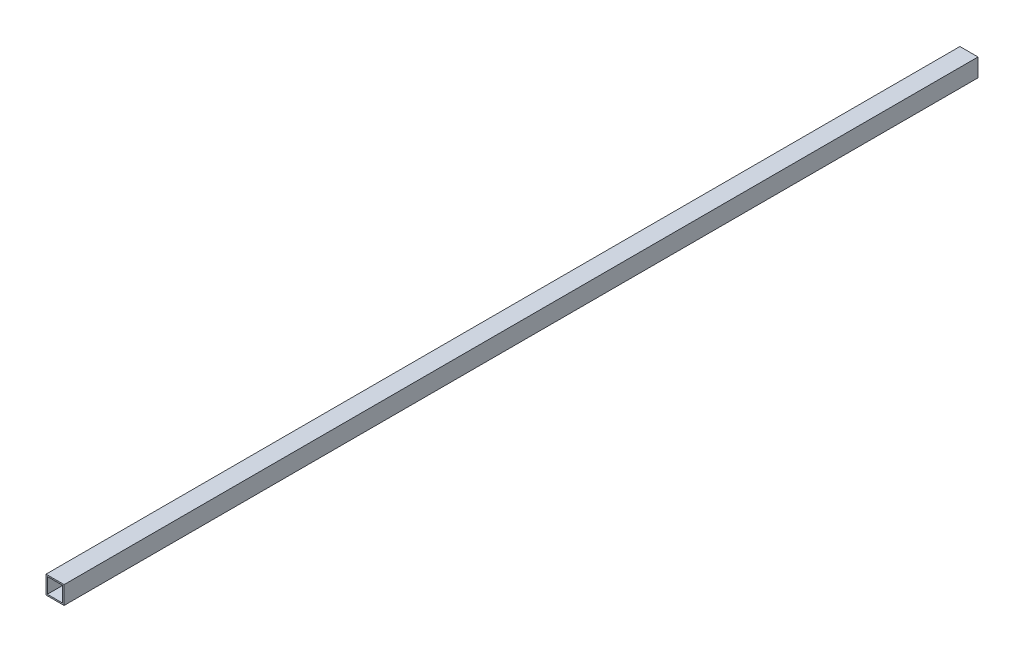
ISO-10303-21;
HEADER;
FILE_DESCRIPTION(('STEP AP214'),'2;1');
FILE_NAME('part.step','',(''),(''),'','','');
FILE_SCHEMA(('AUTOMOTIVE_DESIGN { 1 0 10303 214 1 1 1 1 }'));
ENDSEC;
DATA;
#1=APPLICATION_CONTEXT('core data for automotive mechanical design processes');
#2=APPLICATION_PROTOCOL_DEFINITION('international standard','automotive_design',2000,#1);
#3=PRODUCT_CONTEXT('',#1,'mechanical');
#4=PRODUCT('Part','Part','',(#3));
#5=PRODUCT_RELATED_PRODUCT_CATEGORY('part','',(#4));
#6=PRODUCT_DEFINITION_FORMATION('','',#4);
#7=PRODUCT_DEFINITION_CONTEXT('part definition',#1,'design');
#8=PRODUCT_DEFINITION('design','',#6,#7);
#9=PRODUCT_DEFINITION_SHAPE('','',#8);
#10=(LENGTH_UNIT() NAMED_UNIT(*) SI_UNIT(.MILLI.,.METRE.));
#11=(NAMED_UNIT(*) PLANE_ANGLE_UNIT() SI_UNIT($,.RADIAN.));
#12=(NAMED_UNIT(*) SI_UNIT($,.STERADIAN.) SOLID_ANGLE_UNIT());
#13=UNCERTAINTY_MEASURE_WITH_UNIT(LENGTH_MEASURE(1.E-05),#10,'distance_accuracy_value','');
#14=(GEOMETRIC_REPRESENTATION_CONTEXT(3) GLOBAL_UNCERTAINTY_ASSIGNED_CONTEXT((#13)) GLOBAL_UNIT_ASSIGNED_CONTEXT((#10,
#11,#12)) REPRESENTATION_CONTEXT('',''));
#15=CARTESIAN_POINT('',(0.,0.,0.));
#16=DIRECTION('',(0.,0.,1.));
#17=DIRECTION('',(1.,0.,0.));
#18=AXIS2_PLACEMENT_3D('',#15,#16,#17);
#19=CARTESIAN_POINT('',(0.,0.,2020.));
#20=DIRECTION('',(0.,0.,1.));
#21=DIRECTION('',(1.,0.,0.));
#22=AXIS2_PLACEMENT_3D('',#19,#20,#21);
#23=PLANE('',#22);
#24=DIRECTION('',(0.,1.,0.));
#25=VECTOR('',#24,1.);
#26=CARTESIAN_POINT('',(20.,20.,2020.));
#27=LINE('',#26,#25);
#28=CARTESIAN_POINT('',(20.,-20.,2020.));
#29=VERTEX_POINT('',#28);
#30=CARTESIAN_POINT('',(20.,20.,2020.));
#31=VERTEX_POINT('',#30);
#32=EDGE_CURVE('E137',#29,#31,#27,.T.);
#33=ORIENTED_EDGE('',*,*,#32,.T.);
#34=DIRECTION('',(-1.,0.,0.));
#35=VECTOR('',#34,1.);
#36=CARTESIAN_POINT('',(-20.,20.,2020.));
#37=LINE('',#36,#35);
#38=CARTESIAN_POINT('',(-20.,20.,2020.));
#39=VERTEX_POINT('',#38);
#40=EDGE_CURVE('E140',#31,#39,#37,.T.);
#41=ORIENTED_EDGE('',*,*,#40,.T.);
#42=DIRECTION('',(0.,-1.,0.));
#43=VECTOR('',#42,1.);
#44=CARTESIAN_POINT('',(-20.,20.,2020.));
#45=LINE('',#44,#43);
#46=CARTESIAN_POINT('',(-20.,-20.,2020.));
#47=VERTEX_POINT('',#46);
#48=EDGE_CURVE('E143',#39,#47,#45,.T.);
#49=ORIENTED_EDGE('',*,*,#48,.T.);
#50=DIRECTION('',(1.,0.,0.));
#51=VECTOR('',#50,1.);
#52=CARTESIAN_POINT('',(-20.,-20.,2020.));
#53=LINE('',#52,#51);
#54=EDGE_CURVE('E145',#47,#29,#53,.T.);
#55=ORIENTED_EDGE('',*,*,#54,.T.);
#56=EDGE_LOOP('',(#33,#41,#49,#55));
#57=FACE_BOUND('',#56,.T.);
#58=DIRECTION('',(1.,0.,0.));
#59=VECTOR('',#58,1.);
#60=CARTESIAN_POINT('',(-17.,-17.,2020.));
#61=LINE('',#60,#59);
#62=CARTESIAN_POINT('',(-17.,-17.,2020.));
#63=VERTEX_POINT('',#62);
#64=CARTESIAN_POINT('',(17.,-17.,2020.));
#65=VERTEX_POINT('',#64);
#66=EDGE_CURVE('E109',#63,#65,#61,.T.);
#67=ORIENTED_EDGE('',*,*,#66,.F.);
#68=DIRECTION('',(0.,-1.,0.));
#69=VECTOR('',#68,1.);
#70=CARTESIAN_POINT('',(-17.,17.,2020.));
#71=LINE('',#70,#69);
#72=CARTESIAN_POINT('',(-17.,17.,2020.));
#73=VERTEX_POINT('',#72);
#74=EDGE_CURVE('E101',#73,#63,#71,.T.);
#75=ORIENTED_EDGE('',*,*,#74,.F.);
#76=DIRECTION('',(-1.,0.,0.));
#77=VECTOR('',#76,1.);
#78=CARTESIAN_POINT('',(-17.,17.,2020.));
#79=LINE('',#78,#77);
#80=CARTESIAN_POINT('',(17.,17.,2020.));
#81=VERTEX_POINT('',#80);
#82=EDGE_CURVE('E123',#81,#73,#79,.T.);
#83=ORIENTED_EDGE('',*,*,#82,.F.);
#84=DIRECTION('',(0.,1.,0.));
#85=VECTOR('',#84,1.);
#86=CARTESIAN_POINT('',(17.,17.,2020.));
#87=LINE('',#86,#85);
#88=EDGE_CURVE('E121',#65,#81,#87,.T.);
#89=ORIENTED_EDGE('',*,*,#88,.F.);
#90=EDGE_LOOP('',(#67,#75,#83,#89));
#91=FACE_BOUND('',#90,.T.);
#92=ADVANCED_FACE('F36',(#57,#91),#23,.T.);
#93=CARTESIAN_POINT('',(0.,0.,0.));
#94=DIRECTION('',(0.,0.,1.));
#95=DIRECTION('',(1.,0.,0.));
#96=AXIS2_PLACEMENT_3D('',#93,#94,#95);
#97=PLANE('',#96);
#98=DIRECTION('',(0.,1.,0.));
#99=VECTOR('',#98,1.);
#100=CARTESIAN_POINT('',(20.,20.,0.));
#101=LINE('',#100,#99);
#102=CARTESIAN_POINT('',(20.,-20.,0.));
#103=VERTEX_POINT('',#102);
#104=CARTESIAN_POINT('',(20.,20.,0.));
#105=VERTEX_POINT('',#104);
#106=EDGE_CURVE('E117',#103,#105,#101,.T.);
#107=ORIENTED_EDGE('',*,*,#106,.F.);
#108=DIRECTION('',(1.,0.,0.));
#109=VECTOR('',#108,1.);
#110=CARTESIAN_POINT('',(-20.,-20.,0.));
#111=LINE('',#110,#109);
#112=CARTESIAN_POINT('',(-20.,-20.,0.));
#113=VERTEX_POINT('',#112);
#114=EDGE_CURVE('E141',#113,#103,#111,.T.);
#115=ORIENTED_EDGE('',*,*,#114,.F.);
#116=DIRECTION('',(0.,-1.,0.));
#117=VECTOR('',#116,1.);
#118=CARTESIAN_POINT('',(-20.,20.,0.));
#119=LINE('',#118,#117);
#120=CARTESIAN_POINT('',(-20.,20.,0.));
#121=VERTEX_POINT('',#120);
#122=EDGE_CURVE('E152',#121,#113,#119,.T.);
#123=ORIENTED_EDGE('',*,*,#122,.F.);
#124=DIRECTION('',(-1.,0.,0.));
#125=VECTOR('',#124,1.);
#126=CARTESIAN_POINT('',(-20.,20.,0.));
#127=LINE('',#126,#125);
#128=EDGE_CURVE('E150',#105,#121,#127,.T.);
#129=ORIENTED_EDGE('',*,*,#128,.F.);
#130=EDGE_LOOP('',(#107,#115,#123,#129));
#131=FACE_BOUND('',#130,.T.);
#132=DIRECTION('',(0.,-1.,0.));
#133=VECTOR('',#132,1.);
#134=CARTESIAN_POINT('',(-17.,17.,0.));
#135=LINE('',#134,#133);
#136=CARTESIAN_POINT('',(-17.,17.,0.));
#137=VERTEX_POINT('',#136);
#138=CARTESIAN_POINT('',(-17.,-17.,0.));
#139=VERTEX_POINT('',#138);
#140=EDGE_CURVE('E59',#137,#139,#135,.T.);
#141=ORIENTED_EDGE('',*,*,#140,.T.);
#142=DIRECTION('',(1.,0.,0.));
#143=VECTOR('',#142,1.);
#144=CARTESIAN_POINT('',(-17.,-17.,0.));
#145=LINE('',#144,#143);
#146=CARTESIAN_POINT('',(17.,-17.,0.));
#147=VERTEX_POINT('',#146);
#148=EDGE_CURVE('E116',#139,#147,#145,.T.);
#149=ORIENTED_EDGE('',*,*,#148,.T.);
#150=DIRECTION('',(0.,1.,0.));
#151=VECTOR('',#150,1.);
#152=CARTESIAN_POINT('',(17.,17.,0.));
#153=LINE('',#152,#151);
#154=CARTESIAN_POINT('',(17.,17.,0.));
#155=VERTEX_POINT('',#154);
#156=EDGE_CURVE('E129',#147,#155,#153,.T.);
#157=ORIENTED_EDGE('',*,*,#156,.T.);
#158=DIRECTION('',(-1.,0.,0.));
#159=VECTOR('',#158,1.);
#160=CARTESIAN_POINT('',(-17.,17.,0.));
#161=LINE('',#160,#159);
#162=EDGE_CURVE('E110',#155,#137,#161,.T.);
#163=ORIENTED_EDGE('',*,*,#162,.T.);
#164=EDGE_LOOP('',(#141,#149,#157,#163));
#165=FACE_BOUND('',#164,.T.);
#166=ADVANCED_FACE('F170',(#131,#165),#97,.F.);
#167=CARTESIAN_POINT('',(20.,20.,2020.));
#168=DIRECTION('',(-1.,0.,0.));
#169=DIRECTION('',(0.,-1.,0.));
#170=AXIS2_PLACEMENT_3D('',#167,#168,#169);
#171=PLANE('',#170);
#172=ORIENTED_EDGE('',*,*,#106,.T.);
#173=DIRECTION('',(0.,0.,-1.));
#174=VECTOR('',#173,1.);
#175=CARTESIAN_POINT('',(20.,20.,2020.));
#176=LINE('',#175,#174);
#177=EDGE_CURVE('E11',#31,#105,#176,.T.);
#178=ORIENTED_EDGE('',*,*,#177,.F.);
#179=ORIENTED_EDGE('',*,*,#32,.F.);
#180=DIRECTION('',(0.,0.,-1.));
#181=VECTOR('',#180,1.);
#182=CARTESIAN_POINT('',(20.,-20.,2020.));
#183=LINE('',#182,#181);
#184=EDGE_CURVE('E147',#29,#103,#183,.T.);
#185=ORIENTED_EDGE('',*,*,#184,.T.);
#186=EDGE_LOOP('',(#172,#178,#179,#185));
#187=FACE_BOUND('',#186,.T.);
#188=ADVANCED_FACE('F38',(#187),#171,.F.);
#189=CARTESIAN_POINT('',(-20.,20.,2020.));
#190=DIRECTION('',(0.,-1.,0.));
#191=DIRECTION('',(0.,0.,-1.));
#192=AXIS2_PLACEMENT_3D('',#189,#190,#191);
#193=PLANE('',#192);
#194=ORIENTED_EDGE('',*,*,#128,.T.);
#195=DIRECTION('',(0.,0.,-1.));
#196=VECTOR('',#195,1.);
#197=CARTESIAN_POINT('',(-20.,20.,2020.));
#198=LINE('',#197,#196);
#199=EDGE_CURVE('E44',#39,#121,#198,.T.);
#200=ORIENTED_EDGE('',*,*,#199,.F.);
#201=ORIENTED_EDGE('',*,*,#40,.F.);
#202=ORIENTED_EDGE('',*,*,#177,.T.);
#203=EDGE_LOOP('',(#194,#200,#201,#202));
#204=FACE_BOUND('',#203,.T.);
#205=ADVANCED_FACE('F180',(#204),#193,.F.);
#206=CARTESIAN_POINT('',(-20.,20.,2020.));
#207=DIRECTION('',(1.,0.,0.));
#208=DIRECTION('',(0.,1.,0.));
#209=AXIS2_PLACEMENT_3D('',#206,#207,#208);
#210=PLANE('',#209);
#211=ORIENTED_EDGE('',*,*,#122,.T.);
#212=DIRECTION('',(0.,0.,-1.));
#213=VECTOR('',#212,1.);
#214=CARTESIAN_POINT('',(-20.,-20.,2020.));
#215=LINE('',#214,#213);
#216=EDGE_CURVE('E157',#47,#113,#215,.T.);
#217=ORIENTED_EDGE('',*,*,#216,.F.);
#218=ORIENTED_EDGE('',*,*,#48,.F.);
#219=ORIENTED_EDGE('',*,*,#199,.T.);
#220=EDGE_LOOP('',(#211,#217,#218,#219));
#221=FACE_BOUND('',#220,.T.);
#222=ADVANCED_FACE('F164',(#221),#210,.F.);
#223=CARTESIAN_POINT('',(-20.,-20.,2020.));
#224=DIRECTION('',(0.,1.,0.));
#225=DIRECTION('',(0.,0.,1.));
#226=AXIS2_PLACEMENT_3D('',#223,#224,#225);
#227=PLANE('',#226);
#228=ORIENTED_EDGE('',*,*,#114,.T.);
#229=ORIENTED_EDGE('',*,*,#184,.F.);
#230=ORIENTED_EDGE('',*,*,#54,.F.);
#231=ORIENTED_EDGE('',*,*,#216,.T.);
#232=EDGE_LOOP('',(#228,#229,#230,#231));
#233=FACE_BOUND('',#232,.T.);
#234=ADVANCED_FACE('F174',(#233),#227,.F.);
#235=CARTESIAN_POINT('',(-17.,17.,2020.));
#236=DIRECTION('',(1.,0.,0.));
#237=DIRECTION('',(0.,1.,0.));
#238=AXIS2_PLACEMENT_3D('',#235,#236,#237);
#239=PLANE('',#238);
#240=ORIENTED_EDGE('',*,*,#140,.F.);
#241=DIRECTION('',(0.,0.,-1.));
#242=VECTOR('',#241,1.);
#243=CARTESIAN_POINT('',(-17.,17.,2020.));
#244=LINE('',#243,#242);
#245=EDGE_CURVE('E105',#73,#137,#244,.T.);
#246=ORIENTED_EDGE('',*,*,#245,.F.);
#247=ORIENTED_EDGE('',*,*,#74,.T.);
#248=DIRECTION('',(0.,0.,-1.));
#249=VECTOR('',#248,1.);
#250=CARTESIAN_POINT('',(-17.,-17.,2020.));
#251=LINE('',#250,#249);
#252=EDGE_CURVE('E104',#63,#139,#251,.T.);
#253=ORIENTED_EDGE('',*,*,#252,.T.);
#254=EDGE_LOOP('',(#240,#246,#247,#253));
#255=FACE_BOUND('',#254,.T.);
#256=ADVANCED_FACE('F103',(#255),#239,.T.);
#257=CARTESIAN_POINT('',(-17.,-17.,2020.));
#258=DIRECTION('',(0.,1.,0.));
#259=DIRECTION('',(0.,0.,1.));
#260=AXIS2_PLACEMENT_3D('',#257,#258,#259);
#261=PLANE('',#260);
#262=ORIENTED_EDGE('',*,*,#148,.F.);
#263=ORIENTED_EDGE('',*,*,#252,.F.);
#264=ORIENTED_EDGE('',*,*,#66,.T.);
#265=DIRECTION('',(0.,0.,-1.));
#266=VECTOR('',#265,1.);
#267=CARTESIAN_POINT('',(17.,-17.,2020.));
#268=LINE('',#267,#266);
#269=EDGE_CURVE('E118',#65,#147,#268,.T.);
#270=ORIENTED_EDGE('',*,*,#269,.T.);
#271=EDGE_LOOP('',(#262,#263,#264,#270));
#272=FACE_BOUND('',#271,.T.);
#273=ADVANCED_FACE('F113',(#272),#261,.T.);
#274=CARTESIAN_POINT('',(17.,17.,2020.));
#275=DIRECTION('',(-1.,0.,0.));
#276=DIRECTION('',(0.,-1.,0.));
#277=AXIS2_PLACEMENT_3D('',#274,#275,#276);
#278=PLANE('',#277);
#279=ORIENTED_EDGE('',*,*,#156,.F.);
#280=ORIENTED_EDGE('',*,*,#269,.F.);
#281=ORIENTED_EDGE('',*,*,#88,.T.);
#282=DIRECTION('',(0.,0.,-1.));
#283=VECTOR('',#282,1.);
#284=CARTESIAN_POINT('',(17.,17.,2020.));
#285=LINE('',#284,#283);
#286=EDGE_CURVE('E51',#81,#155,#285,.T.);
#287=ORIENTED_EDGE('',*,*,#286,.T.);
#288=EDGE_LOOP('',(#279,#280,#281,#287));
#289=FACE_BOUND('',#288,.T.);
#290=ADVANCED_FACE('F203',(#289),#278,.T.);
#291=CARTESIAN_POINT('',(-17.,17.,2020.));
#292=DIRECTION('',(0.,-1.,0.));
#293=DIRECTION('',(0.,0.,-1.));
#294=AXIS2_PLACEMENT_3D('',#291,#292,#293);
#295=PLANE('',#294);
#296=ORIENTED_EDGE('',*,*,#162,.F.);
#297=ORIENTED_EDGE('',*,*,#286,.F.);
#298=ORIENTED_EDGE('',*,*,#82,.T.);
#299=ORIENTED_EDGE('',*,*,#245,.T.);
#300=EDGE_LOOP('',(#296,#297,#298,#299));
#301=FACE_BOUND('',#300,.T.);
#302=ADVANCED_FACE('F207',(#301),#295,.T.);
#303=CLOSED_SHELL('',(#92,#166,#188,#205,#222,#234,#256,#273,#290,#302));
#304=MANIFOLD_SOLID_BREP('B2',#303);
#305=ADVANCED_BREP_SHAPE_REPRESENTATION('',(#18,#304),#14);
#306=SHAPE_DEFINITION_REPRESENTATION(#9,#305);
ENDSEC;
END-ISO-10303-21;
